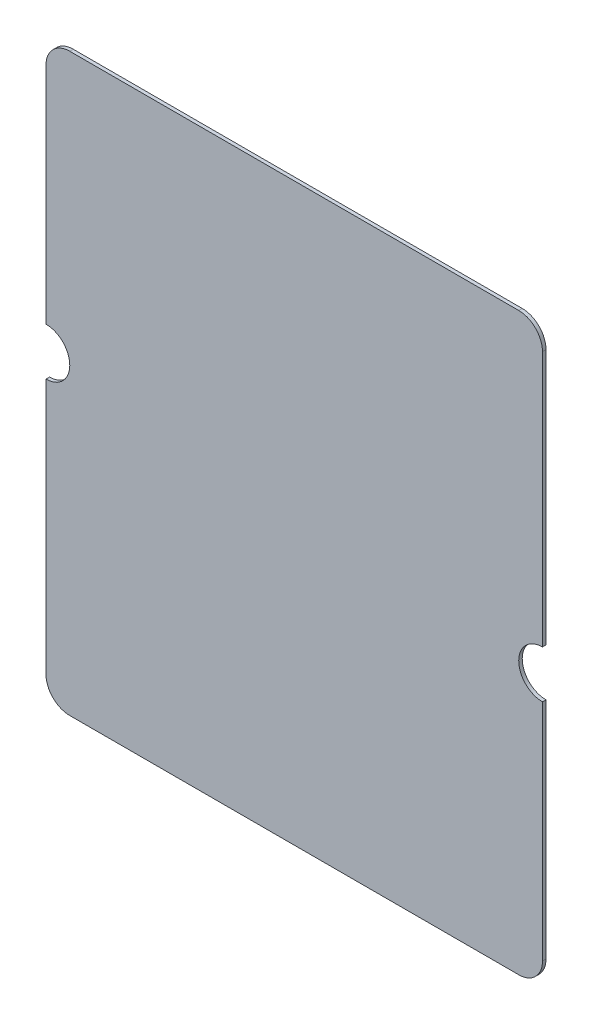
ISO-10303-21;
HEADER;
FILE_DESCRIPTION(('STEP AP214'),'2;1');
FILE_NAME('part.step','',(''),(''),'','','');
FILE_SCHEMA(('AUTOMOTIVE_DESIGN { 1 0 10303 214 1 1 1 1 }'));
ENDSEC;
DATA;
#1=APPLICATION_CONTEXT('core data for automotive mechanical design processes');
#2=APPLICATION_PROTOCOL_DEFINITION('international standard','automotive_design',2000,#1);
#3=PRODUCT_CONTEXT('',#1,'mechanical');
#4=PRODUCT('Part','Part','',(#3));
#5=PRODUCT_RELATED_PRODUCT_CATEGORY('part','',(#4));
#6=PRODUCT_DEFINITION_FORMATION('','',#4);
#7=PRODUCT_DEFINITION_CONTEXT('part definition',#1,'design');
#8=PRODUCT_DEFINITION('design','',#6,#7);
#9=PRODUCT_DEFINITION_SHAPE('','',#8);
#10=(LENGTH_UNIT() NAMED_UNIT(*) SI_UNIT(.MILLI.,.METRE.));
#11=(NAMED_UNIT(*) PLANE_ANGLE_UNIT() SI_UNIT($,.RADIAN.));
#12=(NAMED_UNIT(*) SI_UNIT($,.STERADIAN.) SOLID_ANGLE_UNIT());
#13=UNCERTAINTY_MEASURE_WITH_UNIT(LENGTH_MEASURE(1.E-05),#10,'distance_accuracy_value','');
#14=(GEOMETRIC_REPRESENTATION_CONTEXT(3) GLOBAL_UNCERTAINTY_ASSIGNED_CONTEXT((#13)) GLOBAL_UNIT_ASSIGNED_CONTEXT((#10,
#11,#12)) REPRESENTATION_CONTEXT('',''));
#15=CARTESIAN_POINT('',(0.,0.,0.));
#16=DIRECTION('',(0.,0.,1.));
#17=DIRECTION('',(1.,0.,0.));
#18=AXIS2_PLACEMENT_3D('',#15,#16,#17);
#19=CARTESIAN_POINT('',(198.5,108.75,1.4));
#20=DIRECTION('',(0.,0.,-1.));
#21=DIRECTION('',(-1.,0.,0.));
#22=AXIS2_PLACEMENT_3D('',#19,#20,#21);
#23=CYLINDRICAL_SURFACE('',#22,9.49999999999999);
#24=CARTESIAN_POINT('',(198.5,108.75,0.));
#25=DIRECTION('',(0.,0.,-1.));
#26=DIRECTION('',(1.,0.,0.));
#27=AXIS2_PLACEMENT_3D('',#24,#25,#26);
#28=CIRCLE('',#27,9.49999999999999);
#29=CARTESIAN_POINT('',(198.5,99.25,0.));
#30=VERTEX_POINT('',#29);
#31=CARTESIAN_POINT('',(198.5,118.25,0.));
#32=VERTEX_POINT('',#31);
#33=EDGE_CURVE('E168',#30,#32,#28,.T.);
#34=ORIENTED_EDGE('',*,*,#33,.T.);
#35=DIRECTION('',(0.,0.,-1.));
#36=VECTOR('',#35,1.);
#37=CARTESIAN_POINT('',(198.5,118.25,1.4));
#38=LINE('',#37,#36);
#39=CARTESIAN_POINT('',(198.5,118.25,1.4));
#40=VERTEX_POINT('',#39);
#41=EDGE_CURVE('E11',#40,#32,#38,.T.);
#42=ORIENTED_EDGE('',*,*,#41,.F.);
#43=CARTESIAN_POINT('',(198.5,108.75,1.4));
#44=DIRECTION('',(0.,0.,-1.));
#45=DIRECTION('',(1.,0.,0.));
#46=AXIS2_PLACEMENT_3D('',#43,#44,#45);
#47=CIRCLE('',#46,9.49999999999999);
#48=CARTESIAN_POINT('',(198.5,99.25,1.4));
#49=VERTEX_POINT('',#48);
#50=EDGE_CURVE('E202',#49,#40,#47,.T.);
#51=ORIENTED_EDGE('',*,*,#50,.F.);
#52=DIRECTION('',(0.,0.,-1.));
#53=VECTOR('',#52,1.);
#54=CARTESIAN_POINT('',(198.5,99.25,1.4));
#55=LINE('',#54,#53);
#56=EDGE_CURVE('E164',#49,#30,#55,.T.);
#57=ORIENTED_EDGE('',*,*,#56,.T.);
#58=EDGE_LOOP('',(#34,#42,#51,#57));
#59=FACE_BOUND('',#58,.T.);
#60=ADVANCED_FACE('F43',(#59),#23,.F.);
#61=CARTESIAN_POINT('',(198.5,118.25,1.4));
#62=DIRECTION('',(-1.,0.,0.));
#63=DIRECTION('',(0.,0.,1.));
#64=AXIS2_PLACEMENT_3D('',#61,#62,#63);
#65=PLANE('',#64);
#66=DIRECTION('',(0.,1.,0.));
#67=VECTOR('',#66,1.);
#68=CARTESIAN_POINT('',(198.5,118.25,0.));
#69=LINE('',#68,#67);
#70=CARTESIAN_POINT('',(198.5,220.52,0.));
#71=VERTEX_POINT('',#70);
#72=EDGE_CURVE('E172',#32,#71,#69,.T.);
#73=ORIENTED_EDGE('',*,*,#72,.T.);
#74=DIRECTION('',(0.,0.,-1.));
#75=VECTOR('',#74,1.);
#76=CARTESIAN_POINT('',(198.5,220.52,1.4));
#77=LINE('',#76,#75);
#78=CARTESIAN_POINT('',(198.5,220.52,1.4));
#79=VERTEX_POINT('',#78);
#80=EDGE_CURVE('E52',#79,#71,#77,.T.);
#81=ORIENTED_EDGE('',*,*,#80,.F.);
#82=DIRECTION('',(0.,1.,0.));
#83=VECTOR('',#82,1.);
#84=CARTESIAN_POINT('',(198.5,118.25,1.4));
#85=LINE('',#84,#83);
#86=EDGE_CURVE('E115',#40,#79,#85,.T.);
#87=ORIENTED_EDGE('',*,*,#86,.F.);
#88=ORIENTED_EDGE('',*,*,#41,.T.);
#89=EDGE_LOOP('',(#73,#81,#87,#88));
#90=FACE_BOUND('',#89,.T.);
#91=ADVANCED_FACE('F296',(#90),#65,.F.);
#92=CARTESIAN_POINT('',(189.,220.52,1.4));
#93=DIRECTION('',(0.,0.,-1.));
#94=DIRECTION('',(-1.,0.,0.));
#95=AXIS2_PLACEMENT_3D('',#92,#93,#94);
#96=CYLINDRICAL_SURFACE('',#95,9.50000000000001);
#97=CARTESIAN_POINT('',(189.,220.52,0.));
#98=DIRECTION('',(0.,0.,1.));
#99=DIRECTION('',(-1.,0.,0.));
#100=AXIS2_PLACEMENT_3D('',#97,#98,#99);
#101=CIRCLE('',#100,9.50000000000001);
#102=CARTESIAN_POINT('',(189.,230.02,0.));
#103=VERTEX_POINT('',#102);
#104=EDGE_CURVE('E175',#71,#103,#101,.T.);
#105=ORIENTED_EDGE('',*,*,#104,.T.);
#106=DIRECTION('',(0.,0.,-1.));
#107=VECTOR('',#106,1.);
#108=CARTESIAN_POINT('',(189.,230.02,1.4));
#109=LINE('',#108,#107);
#110=CARTESIAN_POINT('',(189.,230.02,1.4));
#111=VERTEX_POINT('',#110);
#112=EDGE_CURVE('E229',#111,#103,#109,.T.);
#113=ORIENTED_EDGE('',*,*,#112,.F.);
#114=CARTESIAN_POINT('',(189.,220.52,1.4));
#115=DIRECTION('',(0.,0.,1.));
#116=DIRECTION('',(-1.,0.,0.));
#117=AXIS2_PLACEMENT_3D('',#114,#115,#116);
#118=CIRCLE('',#117,9.50000000000001);
#119=EDGE_CURVE('E239',#79,#111,#118,.T.);
#120=ORIENTED_EDGE('',*,*,#119,.F.);
#121=ORIENTED_EDGE('',*,*,#80,.T.);
#122=EDGE_LOOP('',(#105,#113,#120,#121));
#123=FACE_BOUND('',#122,.T.);
#124=ADVANCED_FACE('F237',(#123),#96,.T.);
#125=CARTESIAN_POINT('',(189.,230.02,1.4));
#126=DIRECTION('',(0.,-1.,0.));
#127=DIRECTION('',(0.,0.,-1.));
#128=AXIS2_PLACEMENT_3D('',#125,#126,#127);
#129=PLANE('',#128);
#130=DIRECTION('',(-1.,0.,0.));
#131=VECTOR('',#130,1.);
#132=CARTESIAN_POINT('',(189.,230.02,0.));
#133=LINE('',#132,#131);
#134=CARTESIAN_POINT('',(9.50000000000007,230.02,0.));
#135=VERTEX_POINT('',#134);
#136=EDGE_CURVE('E178',#103,#135,#133,.T.);
#137=ORIENTED_EDGE('',*,*,#136,.T.);
#138=DIRECTION('',(0.,0.,-1.));
#139=VECTOR('',#138,1.);
#140=CARTESIAN_POINT('',(9.50000000000007,230.02,1.4));
#141=LINE('',#140,#139);
#142=CARTESIAN_POINT('',(9.50000000000007,230.02,1.4));
#143=VERTEX_POINT('',#142);
#144=EDGE_CURVE('E225',#143,#135,#141,.T.);
#145=ORIENTED_EDGE('',*,*,#144,.F.);
#146=DIRECTION('',(-1.,0.,0.));
#147=VECTOR('',#146,1.);
#148=CARTESIAN_POINT('',(189.,230.02,1.4));
#149=LINE('',#148,#147);
#150=EDGE_CURVE('E258',#111,#143,#149,.T.);
#151=ORIENTED_EDGE('',*,*,#150,.F.);
#152=ORIENTED_EDGE('',*,*,#112,.T.);
#153=EDGE_LOOP('',(#137,#145,#151,#152));
#154=FACE_BOUND('',#153,.T.);
#155=ADVANCED_FACE('F248',(#154),#129,.F.);
#156=CARTESIAN_POINT('',(9.5,220.52,1.4));
#157=DIRECTION('',(0.,0.,-1.));
#158=DIRECTION('',(-1.,0.,0.));
#159=AXIS2_PLACEMENT_3D('',#156,#157,#158);
#160=CYLINDRICAL_SURFACE('',#159,9.5);
#161=CARTESIAN_POINT('',(9.5,220.52,0.));
#162=DIRECTION('',(0.,0.,1.));
#163=DIRECTION('',(1.,0.,0.));
#164=AXIS2_PLACEMENT_3D('',#161,#162,#163);
#165=CIRCLE('',#164,9.5);
#166=CARTESIAN_POINT('',(0.,220.52,0.));
#167=VERTEX_POINT('',#166);
#168=EDGE_CURVE('E181',#135,#167,#165,.T.);
#169=ORIENTED_EDGE('',*,*,#168,.T.);
#170=DIRECTION('',(0.,0.,-1.));
#171=VECTOR('',#170,1.);
#172=CARTESIAN_POINT('',(0.,220.52,1.4));
#173=LINE('',#172,#171);
#174=CARTESIAN_POINT('',(0.,220.52,1.4));
#175=VERTEX_POINT('',#174);
#176=EDGE_CURVE('E221',#175,#167,#173,.T.);
#177=ORIENTED_EDGE('',*,*,#176,.F.);
#178=CARTESIAN_POINT('',(9.5,220.52,1.4));
#179=DIRECTION('',(0.,0.,1.));
#180=DIRECTION('',(1.,0.,0.));
#181=AXIS2_PLACEMENT_3D('',#178,#179,#180);
#182=CIRCLE('',#181,9.5);
#183=EDGE_CURVE('E254',#143,#175,#182,.T.);
#184=ORIENTED_EDGE('',*,*,#183,.F.);
#185=ORIENTED_EDGE('',*,*,#144,.T.);
#186=EDGE_LOOP('',(#169,#177,#184,#185));
#187=FACE_BOUND('',#186,.T.);
#188=ADVANCED_FACE('F252',(#187),#160,.T.);
#189=CARTESIAN_POINT('',(0.,220.52,1.4));
#190=DIRECTION('',(1.,0.,0.));
#191=DIRECTION('',(0.,1.,0.));
#192=AXIS2_PLACEMENT_3D('',#189,#190,#191);
#193=PLANE('',#192);
#194=DIRECTION('',(0.,-1.,0.));
#195=VECTOR('',#194,1.);
#196=CARTESIAN_POINT('',(0.,220.52,0.));
#197=LINE('',#196,#195);
#198=CARTESIAN_POINT('',(0.,130.77,0.));
#199=VERTEX_POINT('',#198);
#200=EDGE_CURVE('E184',#167,#199,#197,.T.);
#201=ORIENTED_EDGE('',*,*,#200,.T.);
#202=DIRECTION('',(0.,0.,-1.));
#203=VECTOR('',#202,1.);
#204=CARTESIAN_POINT('',(0.,130.77,1.4));
#205=LINE('',#204,#203);
#206=CARTESIAN_POINT('',(0.,130.77,1.4));
#207=VERTEX_POINT('',#206);
#208=EDGE_CURVE('E217',#207,#199,#205,.T.);
#209=ORIENTED_EDGE('',*,*,#208,.F.);
#210=DIRECTION('',(0.,-1.,0.));
#211=VECTOR('',#210,1.);
#212=CARTESIAN_POINT('',(0.,220.52,1.4));
#213=LINE('',#212,#211);
#214=EDGE_CURVE('E257',#175,#207,#213,.T.);
#215=ORIENTED_EDGE('',*,*,#214,.F.);
#216=ORIENTED_EDGE('',*,*,#176,.T.);
#217=EDGE_LOOP('',(#201,#209,#215,#216));
#218=FACE_BOUND('',#217,.T.);
#219=ADVANCED_FACE('F309',(#218),#193,.F.);
#220=CARTESIAN_POINT('',(0.,121.27,1.4));
#221=DIRECTION('',(0.,0.,-1.));
#222=DIRECTION('',(-1.,0.,0.));
#223=AXIS2_PLACEMENT_3D('',#220,#221,#222);
#224=CYLINDRICAL_SURFACE('',#223,9.49999999999999);
#225=CARTESIAN_POINT('',(0.,121.27,0.));
#226=DIRECTION('',(0.,0.,-1.));
#227=DIRECTION('',(-1.,0.,0.));
#228=AXIS2_PLACEMENT_3D('',#225,#226,#227);
#229=CIRCLE('',#228,9.49999999999999);
#230=CARTESIAN_POINT('',(0.,111.77,0.));
#231=VERTEX_POINT('',#230);
#232=EDGE_CURVE('E187',#199,#231,#229,.T.);
#233=ORIENTED_EDGE('',*,*,#232,.T.);
#234=DIRECTION('',(0.,0.,-1.));
#235=VECTOR('',#234,1.);
#236=CARTESIAN_POINT('',(0.,111.77,1.4));
#237=LINE('',#236,#235);
#238=CARTESIAN_POINT('',(0.,111.77,1.4));
#239=VERTEX_POINT('',#238);
#240=EDGE_CURVE('E213',#239,#231,#237,.T.);
#241=ORIENTED_EDGE('',*,*,#240,.F.);
#242=CARTESIAN_POINT('',(0.,121.27,1.4));
#243=DIRECTION('',(0.,0.,-1.));
#244=DIRECTION('',(-1.,0.,0.));
#245=AXIS2_PLACEMENT_3D('',#242,#243,#244);
#246=CIRCLE('',#245,9.49999999999999);
#247=EDGE_CURVE('E262',#207,#239,#246,.T.);
#248=ORIENTED_EDGE('',*,*,#247,.F.);
#249=ORIENTED_EDGE('',*,*,#208,.T.);
#250=EDGE_LOOP('',(#233,#241,#248,#249));
#251=FACE_BOUND('',#250,.T.);
#252=ADVANCED_FACE('F312',(#251),#224,.F.);
#253=CARTESIAN_POINT('',(0.,111.77,1.4));
#254=DIRECTION('',(1.,0.,0.));
#255=DIRECTION('',(0.,1.,0.));
#256=AXIS2_PLACEMENT_3D('',#253,#254,#255);
#257=PLANE('',#256);
#258=DIRECTION('',(0.,-1.,0.));
#259=VECTOR('',#258,1.);
#260=CARTESIAN_POINT('',(0.,111.77,0.));
#261=LINE('',#260,#259);
#262=CARTESIAN_POINT('',(0.,9.5,0.));
#263=VERTEX_POINT('',#262);
#264=EDGE_CURVE('E190',#231,#263,#261,.T.);
#265=ORIENTED_EDGE('',*,*,#264,.T.);
#266=DIRECTION('',(0.,0.,-1.));
#267=VECTOR('',#266,1.);
#268=CARTESIAN_POINT('',(0.,9.5,1.4));
#269=LINE('',#268,#267);
#270=CARTESIAN_POINT('',(0.,9.5,1.4));
#271=VERTEX_POINT('',#270);
#272=EDGE_CURVE('E209',#271,#263,#269,.T.);
#273=ORIENTED_EDGE('',*,*,#272,.F.);
#274=DIRECTION('',(0.,-1.,0.));
#275=VECTOR('',#274,1.);
#276=CARTESIAN_POINT('',(0.,111.77,1.4));
#277=LINE('',#276,#275);
#278=EDGE_CURVE('E269',#239,#271,#277,.T.);
#279=ORIENTED_EDGE('',*,*,#278,.F.);
#280=ORIENTED_EDGE('',*,*,#240,.T.);
#281=EDGE_LOOP('',(#265,#273,#279,#280));
#282=FACE_BOUND('',#281,.T.);
#283=ADVANCED_FACE('F277',(#282),#257,.F.);
#284=CARTESIAN_POINT('',(9.5,9.5,1.4));
#285=DIRECTION('',(0.,0.,-1.));
#286=DIRECTION('',(-1.,0.,0.));
#287=AXIS2_PLACEMENT_3D('',#284,#285,#286);
#288=CYLINDRICAL_SURFACE('',#287,9.5);
#289=CARTESIAN_POINT('',(9.5,9.5,0.));
#290=DIRECTION('',(0.,0.,1.));
#291=DIRECTION('',(-1.,0.,0.));
#292=AXIS2_PLACEMENT_3D('',#289,#290,#291);
#293=CIRCLE('',#292,9.5);
#294=CARTESIAN_POINT('',(9.50000000000007,0.,0.));
#295=VERTEX_POINT('',#294);
#296=EDGE_CURVE('E193',#263,#295,#293,.T.);
#297=ORIENTED_EDGE('',*,*,#296,.T.);
#298=DIRECTION('',(0.,0.,-1.));
#299=VECTOR('',#298,1.);
#300=CARTESIAN_POINT('',(9.50000000000007,0.,1.4));
#301=LINE('',#300,#299);
#302=CARTESIAN_POINT('',(9.50000000000007,0.,1.4));
#303=VERTEX_POINT('',#302);
#304=EDGE_CURVE('E157',#303,#295,#301,.T.);
#305=ORIENTED_EDGE('',*,*,#304,.F.);
#306=CARTESIAN_POINT('',(9.5,9.5,1.4));
#307=DIRECTION('',(0.,0.,1.));
#308=DIRECTION('',(-1.,0.,0.));
#309=AXIS2_PLACEMENT_3D('',#306,#307,#308);
#310=CIRCLE('',#309,9.5);
#311=EDGE_CURVE('E146',#271,#303,#310,.T.);
#312=ORIENTED_EDGE('',*,*,#311,.F.);
#313=ORIENTED_EDGE('',*,*,#272,.T.);
#314=EDGE_LOOP('',(#297,#305,#312,#313));
#315=FACE_BOUND('',#314,.T.);
#316=ADVANCED_FACE('F281',(#315),#288,.T.);
#317=CARTESIAN_POINT('',(9.50000000000007,0.,1.4));
#318=DIRECTION('',(0.,1.,0.));
#319=DIRECTION('',(0.,0.,1.));
#320=AXIS2_PLACEMENT_3D('',#317,#318,#319);
#321=PLANE('',#320);
#322=DIRECTION('',(1.,0.,0.));
#323=VECTOR('',#322,1.);
#324=CARTESIAN_POINT('',(9.50000000000007,0.,0.));
#325=LINE('',#324,#323);
#326=CARTESIAN_POINT('',(189.,0.,0.));
#327=VERTEX_POINT('',#326);
#328=EDGE_CURVE('E155',#295,#327,#325,.T.);
#329=ORIENTED_EDGE('',*,*,#328,.T.);
#330=DIRECTION('',(0.,0.,-1.));
#331=VECTOR('',#330,1.);
#332=CARTESIAN_POINT('',(189.,0.,1.4));
#333=LINE('',#332,#331);
#334=CARTESIAN_POINT('',(189.,0.,1.4));
#335=VERTEX_POINT('',#334);
#336=EDGE_CURVE('E152',#335,#327,#333,.T.);
#337=ORIENTED_EDGE('',*,*,#336,.F.);
#338=DIRECTION('',(1.,0.,0.));
#339=VECTOR('',#338,1.);
#340=CARTESIAN_POINT('',(9.50000000000007,0.,1.4));
#341=LINE('',#340,#339);
#342=EDGE_CURVE('E140',#303,#335,#341,.T.);
#343=ORIENTED_EDGE('',*,*,#342,.F.);
#344=ORIENTED_EDGE('',*,*,#304,.T.);
#345=EDGE_LOOP('',(#329,#337,#343,#344));
#346=FACE_BOUND('',#345,.T.);
#347=ADVANCED_FACE('F153',(#346),#321,.F.);
#348=CARTESIAN_POINT('',(189.,9.5,1.4));
#349=DIRECTION('',(0.,0.,-1.));
#350=DIRECTION('',(-1.,0.,0.));
#351=AXIS2_PLACEMENT_3D('',#348,#349,#350);
#352=CYLINDRICAL_SURFACE('',#351,9.5);
#353=CARTESIAN_POINT('',(189.,9.5,0.));
#354=DIRECTION('',(0.,0.,1.));
#355=DIRECTION('',(1.,0.,0.));
#356=AXIS2_PLACEMENT_3D('',#353,#354,#355);
#357=CIRCLE('',#356,9.5);
#358=CARTESIAN_POINT('',(198.5,9.50000000000007,0.));
#359=VERTEX_POINT('',#358);
#360=EDGE_CURVE('E101',#327,#359,#357,.T.);
#361=ORIENTED_EDGE('',*,*,#360,.T.);
#362=DIRECTION('',(0.,0.,-1.));
#363=VECTOR('',#362,1.);
#364=CARTESIAN_POINT('',(198.5,9.50000000000007,1.4));
#365=LINE('',#364,#363);
#366=CARTESIAN_POINT('',(198.5,9.50000000000007,1.4));
#367=VERTEX_POINT('',#366);
#368=EDGE_CURVE('E158',#367,#359,#365,.T.);
#369=ORIENTED_EDGE('',*,*,#368,.F.);
#370=CARTESIAN_POINT('',(189.,9.5,1.4));
#371=DIRECTION('',(0.,0.,1.));
#372=DIRECTION('',(1.,0.,0.));
#373=AXIS2_PLACEMENT_3D('',#370,#371,#372);
#374=CIRCLE('',#373,9.5);
#375=EDGE_CURVE('E144',#335,#367,#374,.T.);
#376=ORIENTED_EDGE('',*,*,#375,.F.);
#377=ORIENTED_EDGE('',*,*,#336,.T.);
#378=EDGE_LOOP('',(#361,#369,#376,#377));
#379=FACE_BOUND('',#378,.T.);
#380=ADVANCED_FACE('F160',(#379),#352,.T.);
#381=CARTESIAN_POINT('',(198.5,9.50000000000007,1.4));
#382=DIRECTION('',(-1.,0.,0.));
#383=DIRECTION('',(0.,0.,1.));
#384=AXIS2_PLACEMENT_3D('',#381,#382,#383);
#385=PLANE('',#384);
#386=DIRECTION('',(0.,1.,0.));
#387=VECTOR('',#386,1.);
#388=CARTESIAN_POINT('',(198.5,9.50000000000007,0.));
#389=LINE('',#388,#387);
#390=EDGE_CURVE('E107',#359,#30,#389,.T.);
#391=ORIENTED_EDGE('',*,*,#390,.T.);
#392=ORIENTED_EDGE('',*,*,#56,.F.);
#393=DIRECTION('',(0.,1.,0.));
#394=VECTOR('',#393,1.);
#395=CARTESIAN_POINT('',(198.5,9.50000000000007,1.4));
#396=LINE('',#395,#394);
#397=EDGE_CURVE('E60',#367,#49,#396,.T.);
#398=ORIENTED_EDGE('',*,*,#397,.F.);
#399=ORIENTED_EDGE('',*,*,#368,.T.);
#400=EDGE_LOOP('',(#391,#392,#398,#399));
#401=FACE_BOUND('',#400,.T.);
#402=ADVANCED_FACE('F285',(#401),#385,.F.);
#403=CARTESIAN_POINT('',(198.5,108.75,1.4));
#404=DIRECTION('',(0.,0.,1.));
#405=DIRECTION('',(1.,0.,0.));
#406=AXIS2_PLACEMENT_3D('',#403,#404,#405);
#407=PLANE('',#406);
#408=ORIENTED_EDGE('',*,*,#50,.T.);
#409=ORIENTED_EDGE('',*,*,#86,.T.);
#410=ORIENTED_EDGE('',*,*,#119,.T.);
#411=ORIENTED_EDGE('',*,*,#150,.T.);
#412=ORIENTED_EDGE('',*,*,#183,.T.);
#413=ORIENTED_EDGE('',*,*,#214,.T.);
#414=ORIENTED_EDGE('',*,*,#247,.T.);
#415=ORIENTED_EDGE('',*,*,#278,.T.);
#416=ORIENTED_EDGE('',*,*,#311,.T.);
#417=ORIENTED_EDGE('',*,*,#342,.T.);
#418=ORIENTED_EDGE('',*,*,#375,.T.);
#419=ORIENTED_EDGE('',*,*,#397,.T.);
#420=EDGE_LOOP('',(#408,#409,#410,#411,#412,#413,#414,#415,#416,#417,#418,#419));
#421=FACE_BOUND('',#420,.T.);
#422=ADVANCED_FACE('F142',(#421),#407,.T.);
#423=CARTESIAN_POINT('',(198.5,108.75,0.));
#424=DIRECTION('',(0.,0.,1.));
#425=DIRECTION('',(1.,0.,0.));
#426=AXIS2_PLACEMENT_3D('',#423,#424,#425);
#427=PLANE('',#426);
#428=ORIENTED_EDGE('',*,*,#33,.F.);
#429=ORIENTED_EDGE('',*,*,#390,.F.);
#430=ORIENTED_EDGE('',*,*,#360,.F.);
#431=ORIENTED_EDGE('',*,*,#328,.F.);
#432=ORIENTED_EDGE('',*,*,#296,.F.);
#433=ORIENTED_EDGE('',*,*,#264,.F.);
#434=ORIENTED_EDGE('',*,*,#232,.F.);
#435=ORIENTED_EDGE('',*,*,#200,.F.);
#436=ORIENTED_EDGE('',*,*,#168,.F.);
#437=ORIENTED_EDGE('',*,*,#136,.F.);
#438=ORIENTED_EDGE('',*,*,#104,.F.);
#439=ORIENTED_EDGE('',*,*,#72,.F.);
#440=EDGE_LOOP('',(#428,#429,#430,#431,#432,#433,#434,#435,#436,#437,#438,#439));
#441=FACE_BOUND('',#440,.T.);
#442=ADVANCED_FACE('F243',(#441),#427,.F.);
#443=CLOSED_SHELL('',(#60,#91,#124,#155,#188,#219,#252,#283,#316,#347,#380,#402,#422,#442));
#444=MANIFOLD_SOLID_BREP('B2',#443);
#445=ADVANCED_BREP_SHAPE_REPRESENTATION('',(#18,#444),#14);
#446=SHAPE_DEFINITION_REPRESENTATION(#9,#445);
ENDSEC;
END-ISO-10303-21;
